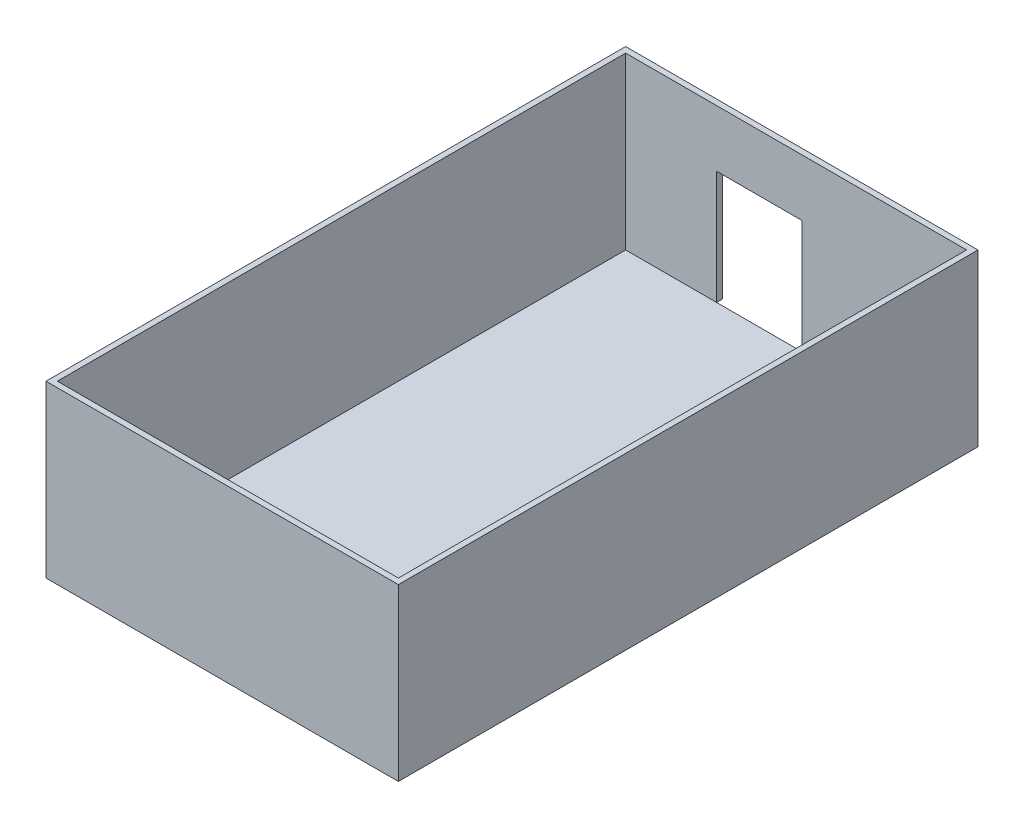
ISO-10303-21;
HEADER;
FILE_DESCRIPTION(('STEP AP214'),'2;1');
FILE_NAME('part.step','',(''),(''),'','','');
FILE_SCHEMA(('AUTOMOTIVE_DESIGN { 1 0 10303 214 1 1 1 1 }'));
ENDSEC;
DATA;
#1=APPLICATION_CONTEXT('core data for automotive mechanical design processes');
#2=APPLICATION_PROTOCOL_DEFINITION('international standard','automotive_design',2000,#1);
#3=PRODUCT_CONTEXT('',#1,'mechanical');
#4=PRODUCT('Part','Part','',(#3));
#5=PRODUCT_RELATED_PRODUCT_CATEGORY('part','',(#4));
#6=PRODUCT_DEFINITION_FORMATION('','',#4);
#7=PRODUCT_DEFINITION_CONTEXT('part definition',#1,'design');
#8=PRODUCT_DEFINITION('design','',#6,#7);
#9=PRODUCT_DEFINITION_SHAPE('','',#8);
#10=(LENGTH_UNIT() NAMED_UNIT(*) SI_UNIT(.MILLI.,.METRE.));
#11=(NAMED_UNIT(*) PLANE_ANGLE_UNIT() SI_UNIT($,.RADIAN.));
#12=(NAMED_UNIT(*) SI_UNIT($,.STERADIAN.) SOLID_ANGLE_UNIT());
#13=UNCERTAINTY_MEASURE_WITH_UNIT(LENGTH_MEASURE(1.E-05),#10,'distance_accuracy_value','');
#14=(GEOMETRIC_REPRESENTATION_CONTEXT(3) GLOBAL_UNCERTAINTY_ASSIGNED_CONTEXT((#13)) GLOBAL_UNIT_ASSIGNED_CONTEXT((#10,
#11,#12)) REPRESENTATION_CONTEXT('',''));
#15=CARTESIAN_POINT('',(0.,0.,0.));
#16=DIRECTION('',(0.,0.,1.));
#17=DIRECTION('',(1.,0.,0.));
#18=AXIS2_PLACEMENT_3D('',#15,#16,#17);
#19=CARTESIAN_POINT('',(0.,3010.,0.));
#20=DIRECTION('',(0.,1.,0.));
#21=DIRECTION('',(0.,0.,1.));
#22=AXIS2_PLACEMENT_3D('',#19,#20,#21);
#23=PLANE('',#22);
#24=DIRECTION('',(1.,0.,0.));
#25=VECTOR('',#24,1.);
#26=CARTESIAN_POINT('',(-6100.,3010.,100.));
#27=LINE('',#26,#25);
#28=CARTESIAN_POINT('',(-6100.,3010.,100.));
#29=VERTEX_POINT('',#28);
#30=CARTESIAN_POINT('',(100.,3010.,100.));
#31=VERTEX_POINT('',#30);
#32=EDGE_CURVE('E230',#29,#31,#27,.T.);
#33=ORIENTED_EDGE('',*,*,#32,.T.);
#34=DIRECTION('',(0.,0.,-1.));
#35=VECTOR('',#34,1.);
#36=CARTESIAN_POINT('',(100.,3010.,100.));
#37=LINE('',#36,#35);
#38=CARTESIAN_POINT('',(100.,3010.,-10100.));
#39=VERTEX_POINT('',#38);
#40=EDGE_CURVE('E234',#31,#39,#37,.T.);
#41=ORIENTED_EDGE('',*,*,#40,.T.);
#42=DIRECTION('',(-1.,0.,0.));
#43=VECTOR('',#42,1.);
#44=CARTESIAN_POINT('',(100.,3010.,-10100.));
#45=LINE('',#44,#43);
#46=CARTESIAN_POINT('',(-6100.,3010.,-10100.));
#47=VERTEX_POINT('',#46);
#48=EDGE_CURVE('E238',#39,#47,#45,.T.);
#49=ORIENTED_EDGE('',*,*,#48,.T.);
#50=DIRECTION('',(0.,0.,1.));
#51=VECTOR('',#50,1.);
#52=CARTESIAN_POINT('',(-6100.,3010.,-10100.));
#53=LINE('',#52,#51);
#54=EDGE_CURVE('E241',#47,#29,#53,.T.);
#55=ORIENTED_EDGE('',*,*,#54,.T.);
#56=EDGE_LOOP('',(#33,#41,#49,#55));
#57=FACE_BOUND('',#56,.T.);
#58=DIRECTION('',(0.,0.,-1.));
#59=VECTOR('',#58,1.);
#60=CARTESIAN_POINT('',(0.,3010.,0.));
#61=LINE('',#60,#59);
#62=CARTESIAN_POINT('',(0.,3010.,0.));
#63=VERTEX_POINT('',#62);
#64=CARTESIAN_POINT('',(0.,3010.,-10000.));
#65=VERTEX_POINT('',#64);
#66=EDGE_CURVE('E192',#63,#65,#61,.T.);
#67=ORIENTED_EDGE('',*,*,#66,.F.);
#68=DIRECTION('',(1.,0.,0.));
#69=VECTOR('',#68,1.);
#70=CARTESIAN_POINT('',(-6000.,3010.,0.));
#71=LINE('',#70,#69);
#72=CARTESIAN_POINT('',(-6000.,3010.,0.));
#73=VERTEX_POINT('',#72);
#74=EDGE_CURVE('E189',#73,#63,#71,.T.);
#75=ORIENTED_EDGE('',*,*,#74,.F.);
#76=DIRECTION('',(0.,0.,1.));
#77=VECTOR('',#76,1.);
#78=CARTESIAN_POINT('',(-6000.,3010.,-10000.));
#79=LINE('',#78,#77);
#80=CARTESIAN_POINT('',(-6000.,3010.,-10000.));
#81=VERTEX_POINT('',#80);
#82=EDGE_CURVE('E199',#81,#73,#79,.T.);
#83=ORIENTED_EDGE('',*,*,#82,.F.);
#84=DIRECTION('',(-1.,0.,0.));
#85=VECTOR('',#84,1.);
#86=CARTESIAN_POINT('',(0.,3010.,-10000.));
#87=LINE('',#86,#85);
#88=EDGE_CURVE('E196',#65,#81,#87,.T.);
#89=ORIENTED_EDGE('',*,*,#88,.F.);
#90=EDGE_LOOP('',(#67,#75,#83,#89));
#91=FACE_BOUND('',#90,.T.);
#92=ADVANCED_FACE('F53',(#57,#91),#23,.T.);
#93=CARTESIAN_POINT('',(0.,10.,0.));
#94=DIRECTION('',(0.,1.,0.));
#95=DIRECTION('',(0.,0.,1.));
#96=AXIS2_PLACEMENT_3D('',#93,#94,#95);
#97=PLANE('',#96);
#98=DIRECTION('',(-1.,0.,0.));
#99=VECTOR('',#98,1.);
#100=CARTESIAN_POINT('',(100.,10.,-10100.));
#101=LINE('',#100,#99);
#102=CARTESIAN_POINT('',(-4400.,10.,-10100.));
#103=VERTEX_POINT('',#102);
#104=CARTESIAN_POINT('',(-6100.,10.,-10100.));
#105=VERTEX_POINT('',#104);
#106=EDGE_CURVE('E251',#103,#105,#101,.T.);
#107=ORIENTED_EDGE('',*,*,#106,.F.);
#108=DIRECTION('',(0.,0.,-1.));
#109=VECTOR('',#108,1.);
#110=CARTESIAN_POINT('',(-4400.,10.,-10000.));
#111=LINE('',#110,#109);
#112=CARTESIAN_POINT('',(-4400.,10.,-10000.));
#113=VERTEX_POINT('',#112);
#114=EDGE_CURVE('E179',#113,#103,#111,.T.);
#115=ORIENTED_EDGE('',*,*,#114,.F.);
#116=DIRECTION('',(-1.,0.,0.));
#117=VECTOR('',#116,1.);
#118=CARTESIAN_POINT('',(0.,10.,-10000.));
#119=LINE('',#118,#117);
#120=CARTESIAN_POINT('',(-6000.,10.,-10000.));
#121=VERTEX_POINT('',#120);
#122=EDGE_CURVE('E165',#113,#121,#119,.T.);
#123=ORIENTED_EDGE('',*,*,#122,.T.);
#124=DIRECTION('',(0.,0.,1.));
#125=VECTOR('',#124,1.);
#126=CARTESIAN_POINT('',(-6000.,10.,-10000.));
#127=LINE('',#126,#125);
#128=CARTESIAN_POINT('',(-6000.,10.,0.));
#129=VERTEX_POINT('',#128);
#130=EDGE_CURVE('E193',#121,#129,#127,.T.);
#131=ORIENTED_EDGE('',*,*,#130,.T.);
#132=DIRECTION('',(1.,0.,0.));
#133=VECTOR('',#132,1.);
#134=CARTESIAN_POINT('',(-6000.,10.,0.));
#135=LINE('',#134,#133);
#136=CARTESIAN_POINT('',(0.,10.,0.));
#137=VERTEX_POINT('',#136);
#138=EDGE_CURVE('E182',#129,#137,#135,.T.);
#139=ORIENTED_EDGE('',*,*,#138,.T.);
#140=DIRECTION('',(0.,0.,-1.));
#141=VECTOR('',#140,1.);
#142=CARTESIAN_POINT('',(0.,10.,0.));
#143=LINE('',#142,#141);
#144=CARTESIAN_POINT('',(0.,10.,-10000.));
#145=VERTEX_POINT('',#144);
#146=EDGE_CURVE('E206',#137,#145,#143,.T.);
#147=ORIENTED_EDGE('',*,*,#146,.T.);
#148=CARTESIAN_POINT('',(-2900.,10.0000000000001,-10000.));
#149=VERTEX_POINT('',#148);
#150=EDGE_CURVE('E210',#145,#149,#119,.T.);
#151=ORIENTED_EDGE('',*,*,#150,.T.);
#152=DIRECTION('',(0.,0.,-1.));
#153=VECTOR('',#152,1.);
#154=CARTESIAN_POINT('',(-2900.,10.0000000000001,-10000.));
#155=LINE('',#154,#153);
#156=CARTESIAN_POINT('',(-2900.,10.0000000000001,-10100.));
#157=VERTEX_POINT('',#156);
#158=EDGE_CURVE('E183',#149,#157,#155,.T.);
#159=ORIENTED_EDGE('',*,*,#158,.T.);
#160=CARTESIAN_POINT('',(100.,10.,-10100.));
#161=VERTEX_POINT('',#160);
#162=EDGE_CURVE('E252',#161,#157,#101,.T.);
#163=ORIENTED_EDGE('',*,*,#162,.F.);
#164=DIRECTION('',(0.,0.,-1.));
#165=VECTOR('',#164,1.);
#166=CARTESIAN_POINT('',(100.,10.,100.));
#167=LINE('',#166,#165);
#168=CARTESIAN_POINT('',(100.,10.,100.));
#169=VERTEX_POINT('',#168);
#170=EDGE_CURVE('E248',#169,#161,#167,.T.);
#171=ORIENTED_EDGE('',*,*,#170,.F.);
#172=DIRECTION('',(1.,0.,0.));
#173=VECTOR('',#172,1.);
#174=CARTESIAN_POINT('',(-6100.,10.,100.));
#175=LINE('',#174,#173);
#176=CARTESIAN_POINT('',(-6100.,10.,100.));
#177=VERTEX_POINT('',#176);
#178=EDGE_CURVE('E229',#177,#169,#175,.T.);
#179=ORIENTED_EDGE('',*,*,#178,.F.);
#180=DIRECTION('',(0.,0.,1.));
#181=VECTOR('',#180,1.);
#182=CARTESIAN_POINT('',(-6100.,10.,-10100.));
#183=LINE('',#182,#181);
#184=EDGE_CURVE('E235',#105,#177,#183,.T.);
#185=ORIENTED_EDGE('',*,*,#184,.F.);
#186=EDGE_LOOP('',(#107,#115,#123,#131,#139,#147,#151,#159,#163,#171,#179,#185));
#187=FACE_BOUND('',#186,.T.);
#188=ADVANCED_FACE('F276',(#187),#97,.F.);
#189=CARTESIAN_POINT('',(-6100.,3010.,100.));
#190=DIRECTION('',(0.,0.,-1.));
#191=DIRECTION('',(-1.,0.,0.));
#192=AXIS2_PLACEMENT_3D('',#189,#190,#191);
#193=PLANE('',#192);
#194=ORIENTED_EDGE('',*,*,#178,.T.);
#195=DIRECTION('',(0.,-1.,0.));
#196=VECTOR('',#195,1.);
#197=CARTESIAN_POINT('',(100.,3010.,100.));
#198=LINE('',#197,#196);
#199=EDGE_CURVE('E12',#31,#169,#198,.T.);
#200=ORIENTED_EDGE('',*,*,#199,.F.);
#201=ORIENTED_EDGE('',*,*,#32,.F.);
#202=DIRECTION('',(0.,-1.,0.));
#203=VECTOR('',#202,1.);
#204=CARTESIAN_POINT('',(-6100.,3010.,100.));
#205=LINE('',#204,#203);
#206=EDGE_CURVE('E244',#29,#177,#205,.T.);
#207=ORIENTED_EDGE('',*,*,#206,.T.);
#208=EDGE_LOOP('',(#194,#200,#201,#207));
#209=FACE_BOUND('',#208,.T.);
#210=ADVANCED_FACE('F55',(#209),#193,.F.);
#211=CARTESIAN_POINT('',(100.,3010.,100.));
#212=DIRECTION('',(-1.,0.,0.));
#213=DIRECTION('',(0.,0.,1.));
#214=AXIS2_PLACEMENT_3D('',#211,#212,#213);
#215=PLANE('',#214);
#216=ORIENTED_EDGE('',*,*,#170,.T.);
#217=DIRECTION('',(0.,-1.,0.));
#218=VECTOR('',#217,1.);
#219=CARTESIAN_POINT('',(100.,3010.,-10100.));
#220=LINE('',#219,#218);
#221=EDGE_CURVE('E62',#39,#161,#220,.T.);
#222=ORIENTED_EDGE('',*,*,#221,.F.);
#223=ORIENTED_EDGE('',*,*,#40,.F.);
#224=ORIENTED_EDGE('',*,*,#199,.T.);
#225=EDGE_LOOP('',(#216,#222,#223,#224));
#226=FACE_BOUND('',#225,.T.);
#227=ADVANCED_FACE('F304',(#226),#215,.F.);
#228=CARTESIAN_POINT('',(100.,3010.,-10100.));
#229=DIRECTION('',(0.,0.,1.));
#230=DIRECTION('',(1.,0.,0.));
#231=AXIS2_PLACEMENT_3D('',#228,#229,#230);
#232=PLANE('',#231);
#233=DIRECTION('',(1.,0.,0.));
#234=VECTOR('',#233,1.);
#235=CARTESIAN_POINT('',(-4400.,2010.,-10100.));
#236=LINE('',#235,#234);
#237=CARTESIAN_POINT('',(-4400.,2010.,-10100.));
#238=VERTEX_POINT('',#237);
#239=CARTESIAN_POINT('',(-2900.,2010.,-10100.));
#240=VERTEX_POINT('',#239);
#241=EDGE_CURVE('E170',#238,#240,#236,.T.);
#242=ORIENTED_EDGE('',*,*,#241,.F.);
#243=DIRECTION('',(0.,1.,0.));
#244=VECTOR('',#243,1.);
#245=CARTESIAN_POINT('',(-4400.,10.,-10100.));
#246=LINE('',#245,#244);
#247=EDGE_CURVE('E150',#103,#238,#246,.T.);
#248=ORIENTED_EDGE('',*,*,#247,.F.);
#249=ORIENTED_EDGE('',*,*,#106,.T.);
#250=DIRECTION('',(0.,-1.,0.));
#251=VECTOR('',#250,1.);
#252=CARTESIAN_POINT('',(-6100.,3010.,-10100.));
#253=LINE('',#252,#251);
#254=EDGE_CURVE('E261',#47,#105,#253,.T.);
#255=ORIENTED_EDGE('',*,*,#254,.F.);
#256=ORIENTED_EDGE('',*,*,#48,.F.);
#257=ORIENTED_EDGE('',*,*,#221,.T.);
#258=ORIENTED_EDGE('',*,*,#162,.T.);
#259=DIRECTION('',(0.,-1.,0.));
#260=VECTOR('',#259,1.);
#261=CARTESIAN_POINT('',(-2900.,10.0000000000001,-10100.));
#262=LINE('',#261,#260);
#263=EDGE_CURVE('E167',#240,#157,#262,.T.);
#264=ORIENTED_EDGE('',*,*,#263,.F.);
#265=EDGE_LOOP('',(#242,#248,#249,#255,#256,#257,#258,#264));
#266=FACE_BOUND('',#265,.T.);
#267=ADVANCED_FACE('F270',(#266),#232,.F.);
#268=CARTESIAN_POINT('',(-6100.,3010.,-10100.));
#269=DIRECTION('',(1.,0.,0.));
#270=DIRECTION('',(0.,0.,-1.));
#271=AXIS2_PLACEMENT_3D('',#268,#269,#270);
#272=PLANE('',#271);
#273=ORIENTED_EDGE('',*,*,#184,.T.);
#274=ORIENTED_EDGE('',*,*,#206,.F.);
#275=ORIENTED_EDGE('',*,*,#54,.F.);
#276=ORIENTED_EDGE('',*,*,#254,.T.);
#277=EDGE_LOOP('',(#273,#274,#275,#276));
#278=FACE_BOUND('',#277,.T.);
#279=ADVANCED_FACE('F298',(#278),#272,.F.);
#280=CARTESIAN_POINT('',(-6000.,3010.,0.));
#281=DIRECTION('',(0.,0.,-1.));
#282=DIRECTION('',(-1.,0.,0.));
#283=AXIS2_PLACEMENT_3D('',#280,#281,#282);
#284=PLANE('',#283);
#285=ORIENTED_EDGE('',*,*,#138,.F.);
#286=DIRECTION('',(0.,-1.,0.));
#287=VECTOR('',#286,1.);
#288=CARTESIAN_POINT('',(-6000.,3010.,0.));
#289=LINE('',#288,#287);
#290=EDGE_CURVE('E202',#73,#129,#289,.T.);
#291=ORIENTED_EDGE('',*,*,#290,.F.);
#292=ORIENTED_EDGE('',*,*,#74,.T.);
#293=DIRECTION('',(0.,-1.,0.));
#294=VECTOR('',#293,1.);
#295=CARTESIAN_POINT('',(0.,3010.,0.));
#296=LINE('',#295,#294);
#297=EDGE_CURVE('E225',#63,#137,#296,.T.);
#298=ORIENTED_EDGE('',*,*,#297,.T.);
#299=EDGE_LOOP('',(#285,#291,#292,#298));
#300=FACE_BOUND('',#299,.T.);
#301=ADVANCED_FACE('F287',(#300),#284,.T.);
#302=CARTESIAN_POINT('',(0.,3010.,0.));
#303=DIRECTION('',(-1.,0.,0.));
#304=DIRECTION('',(0.,0.,1.));
#305=AXIS2_PLACEMENT_3D('',#302,#303,#304);
#306=PLANE('',#305);
#307=ORIENTED_EDGE('',*,*,#146,.F.);
#308=ORIENTED_EDGE('',*,*,#297,.F.);
#309=ORIENTED_EDGE('',*,*,#66,.T.);
#310=DIRECTION('',(0.,-1.,0.));
#311=VECTOR('',#310,1.);
#312=CARTESIAN_POINT('',(0.,3010.,-10000.));
#313=LINE('',#312,#311);
#314=EDGE_CURVE('E222',#65,#145,#313,.T.);
#315=ORIENTED_EDGE('',*,*,#314,.T.);
#316=EDGE_LOOP('',(#307,#308,#309,#315));
#317=FACE_BOUND('',#316,.T.);
#318=ADVANCED_FACE('F284',(#317),#306,.T.);
#319=CARTESIAN_POINT('',(0.,3010.,-10000.));
#320=DIRECTION('',(0.,0.,1.));
#321=DIRECTION('',(1.,0.,0.));
#322=AXIS2_PLACEMENT_3D('',#319,#320,#321);
#323=PLANE('',#322);
#324=DIRECTION('',(0.,1.,0.));
#325=VECTOR('',#324,1.);
#326=CARTESIAN_POINT('',(-4400.,10.,-10000.));
#327=LINE('',#326,#325);
#328=CARTESIAN_POINT('',(-4400.,2010.,-10000.));
#329=VERTEX_POINT('',#328);
#330=EDGE_CURVE('E147',#113,#329,#327,.T.);
#331=ORIENTED_EDGE('',*,*,#330,.T.);
#332=DIRECTION('',(1.,0.,0.));
#333=VECTOR('',#332,1.);
#334=CARTESIAN_POINT('',(-4400.,2010.,-10000.));
#335=LINE('',#334,#333);
#336=CARTESIAN_POINT('',(-2900.,2010.,-10000.));
#337=VERTEX_POINT('',#336);
#338=EDGE_CURVE('E158',#329,#337,#335,.T.);
#339=ORIENTED_EDGE('',*,*,#338,.T.);
#340=DIRECTION('',(0.,-1.,0.));
#341=VECTOR('',#340,1.);
#342=CARTESIAN_POINT('',(-2900.,10.0000000000001,-10000.));
#343=LINE('',#342,#341);
#344=EDGE_CURVE('E69',#337,#149,#343,.T.);
#345=ORIENTED_EDGE('',*,*,#344,.T.);
#346=ORIENTED_EDGE('',*,*,#150,.F.);
#347=ORIENTED_EDGE('',*,*,#314,.F.);
#348=ORIENTED_EDGE('',*,*,#88,.T.);
#349=DIRECTION('',(0.,-1.,0.));
#350=VECTOR('',#349,1.);
#351=CARTESIAN_POINT('',(-6000.,3010.,-10000.));
#352=LINE('',#351,#350);
#353=EDGE_CURVE('E77',#81,#121,#352,.T.);
#354=ORIENTED_EDGE('',*,*,#353,.T.);
#355=ORIENTED_EDGE('',*,*,#122,.F.);
#356=EDGE_LOOP('',(#331,#339,#345,#346,#347,#348,#354,#355));
#357=FACE_BOUND('',#356,.T.);
#358=ADVANCED_FACE('F164',(#357),#323,.T.);
#359=CARTESIAN_POINT('',(-6000.,3010.,-10000.));
#360=DIRECTION('',(1.,0.,0.));
#361=DIRECTION('',(0.,0.,-1.));
#362=AXIS2_PLACEMENT_3D('',#359,#360,#361);
#363=PLANE('',#362);
#364=ORIENTED_EDGE('',*,*,#130,.F.);
#365=ORIENTED_EDGE('',*,*,#353,.F.);
#366=ORIENTED_EDGE('',*,*,#82,.T.);
#367=ORIENTED_EDGE('',*,*,#290,.T.);
#368=EDGE_LOOP('',(#364,#365,#366,#367));
#369=FACE_BOUND('',#368,.T.);
#370=ADVANCED_FACE('F292',(#369),#363,.T.);
#371=CARTESIAN_POINT('',(-4400.,10.,-10000.));
#372=DIRECTION('',(-1.,0.,0.));
#373=DIRECTION('',(0.,0.,1.));
#374=AXIS2_PLACEMENT_3D('',#371,#372,#373);
#375=PLANE('',#374);
#376=ORIENTED_EDGE('',*,*,#247,.T.);
#377=DIRECTION('',(0.,0.,-1.));
#378=VECTOR('',#377,1.);
#379=CARTESIAN_POINT('',(-4400.,2010.,-10000.));
#380=LINE('',#379,#378);
#381=EDGE_CURVE('E143',#329,#238,#380,.T.);
#382=ORIENTED_EDGE('',*,*,#381,.F.);
#383=ORIENTED_EDGE('',*,*,#330,.F.);
#384=ORIENTED_EDGE('',*,*,#114,.T.);
#385=EDGE_LOOP('',(#376,#382,#383,#384));
#386=FACE_BOUND('',#385,.T.);
#387=ADVANCED_FACE('F145',(#386),#375,.F.);
#388=CARTESIAN_POINT('',(-2900.,10.0000000000001,-10000.));
#389=DIRECTION('',(1.,0.,0.));
#390=DIRECTION('',(0.,0.,-1.));
#391=AXIS2_PLACEMENT_3D('',#388,#389,#390);
#392=PLANE('',#391);
#393=ORIENTED_EDGE('',*,*,#263,.T.);
#394=ORIENTED_EDGE('',*,*,#158,.F.);
#395=ORIENTED_EDGE('',*,*,#344,.F.);
#396=DIRECTION('',(0.,0.,-1.));
#397=VECTOR('',#396,1.);
#398=CARTESIAN_POINT('',(-2900.,2010.,-10000.));
#399=LINE('',#398,#397);
#400=EDGE_CURVE('E155',#337,#240,#399,.T.);
#401=ORIENTED_EDGE('',*,*,#400,.T.);
#402=EDGE_LOOP('',(#393,#394,#395,#401));
#403=FACE_BOUND('',#402,.T.);
#404=ADVANCED_FACE('F279',(#403),#392,.F.);
#405=CARTESIAN_POINT('',(-4400.,2010.,-10000.));
#406=DIRECTION('',(0.,1.,0.));
#407=DIRECTION('',(0.,0.,1.));
#408=AXIS2_PLACEMENT_3D('',#405,#406,#407);
#409=PLANE('',#408);
#410=ORIENTED_EDGE('',*,*,#241,.T.);
#411=ORIENTED_EDGE('',*,*,#400,.F.);
#412=ORIENTED_EDGE('',*,*,#338,.F.);
#413=ORIENTED_EDGE('',*,*,#381,.T.);
#414=EDGE_LOOP('',(#410,#411,#412,#413));
#415=FACE_BOUND('',#414,.T.);
#416=ADVANCED_FACE('F159',(#415),#409,.F.);
#417=CLOSED_SHELL('',(#92,#188,#210,#227,#267,#279,#301,#318,#358,#370,#387,#404,#416));
#418=MANIFOLD_SOLID_BREP('B2',#417);
#419=CARTESIAN_POINT('',(0.,10.,0.));
#420=DIRECTION('',(-1.,0.,0.));
#421=DIRECTION('',(0.,0.,1.));
#422=AXIS2_PLACEMENT_3D('',#419,#420,#421);
#423=PLANE('',#422);
#424=DIRECTION('',(0.,0.,-1.));
#425=VECTOR('',#424,1.);
#426=CARTESIAN_POINT('',(0.,0.,0.));
#427=LINE('',#426,#425);
#428=CARTESIAN_POINT('',(0.,0.,0.));
#429=VERTEX_POINT('',#428);
#430=CARTESIAN_POINT('',(0.,0.,-10000.));
#431=VERTEX_POINT('',#430);
#432=EDGE_CURVE('E499',#429,#431,#427,.T.);
#433=ORIENTED_EDGE('',*,*,#432,.T.);
#434=DIRECTION('',(0.,-1.,0.));
#435=VECTOR('',#434,1.);
#436=CARTESIAN_POINT('',(0.,10.,-10000.));
#437=LINE('',#436,#435);
#438=CARTESIAN_POINT('',(0.,10.,-10000.));
#439=VERTEX_POINT('',#438);
#440=EDGE_CURVE('E51',#439,#431,#437,.T.);
#441=ORIENTED_EDGE('',*,*,#440,.F.);
#442=DIRECTION('',(0.,0.,-1.));
#443=VECTOR('',#442,1.);
#444=CARTESIAN_POINT('',(0.,10.,0.));
#445=LINE('',#444,#443);
#446=CARTESIAN_POINT('',(0.,10.,0.));
#447=VERTEX_POINT('',#446);
#448=EDGE_CURVE('E487',#447,#439,#445,.T.);
#449=ORIENTED_EDGE('',*,*,#448,.F.);
#450=DIRECTION('',(0.,-1.,0.));
#451=VECTOR('',#450,1.);
#452=CARTESIAN_POINT('',(0.,10.,0.));
#453=LINE('',#452,#451);
#454=EDGE_CURVE('E495',#447,#429,#453,.T.);
#455=ORIENTED_EDGE('',*,*,#454,.T.);
#456=EDGE_LOOP('',(#433,#441,#449,#455));
#457=FACE_BOUND('',#456,.T.);
#458=ADVANCED_FACE('F436',(#457),#423,.F.);
#459=CARTESIAN_POINT('',(0.,10.,-10000.));
#460=DIRECTION('',(0.,0.,1.));
#461=DIRECTION('',(1.,0.,0.));
#462=AXIS2_PLACEMENT_3D('',#459,#460,#461);
#463=PLANE('',#462);
#464=DIRECTION('',(-1.,0.,0.));
#465=VECTOR('',#464,1.);
#466=CARTESIAN_POINT('',(0.,0.,-10000.));
#467=LINE('',#466,#465);
#468=CARTESIAN_POINT('',(-6000.,0.,-10000.));
#469=VERTEX_POINT('',#468);
#470=EDGE_CURVE('E491',#431,#469,#467,.T.);
#471=ORIENTED_EDGE('',*,*,#470,.T.);
#472=DIRECTION('',(0.,-1.,0.));
#473=VECTOR('',#472,1.);
#474=CARTESIAN_POINT('',(-6000.,10.,-10000.));
#475=LINE('',#474,#473);
#476=CARTESIAN_POINT('',(-6000.,10.,-10000.));
#477=VERTEX_POINT('',#476);
#478=EDGE_CURVE('E444',#477,#469,#475,.T.);
#479=ORIENTED_EDGE('',*,*,#478,.F.);
#480=DIRECTION('',(-1.,0.,0.));
#481=VECTOR('',#480,1.);
#482=CARTESIAN_POINT('',(0.,10.,-10000.));
#483=LINE('',#482,#481);
#484=EDGE_CURVE('E482',#439,#477,#483,.T.);
#485=ORIENTED_EDGE('',*,*,#484,.F.);
#486=ORIENTED_EDGE('',*,*,#440,.T.);
#487=EDGE_LOOP('',(#471,#479,#485,#486));
#488=FACE_BOUND('',#487,.T.);
#489=ADVANCED_FACE('F490',(#488),#463,.F.);
#490=CARTESIAN_POINT('',(-6000.,10.,0.));
#491=DIRECTION('',(1.,0.,0.));
#492=DIRECTION('',(0.,0.,-1.));
#493=AXIS2_PLACEMENT_3D('',#490,#491,#492);
#494=PLANE('',#493);
#495=DIRECTION('',(0.,0.,1.));
#496=VECTOR('',#495,1.);
#497=CARTESIAN_POINT('',(-6000.,0.,0.));
#498=LINE('',#497,#496);
#499=CARTESIAN_POINT('',(-6000.,0.,0.));
#500=VERTEX_POINT('',#499);
#501=EDGE_CURVE('E469',#469,#500,#498,.T.);
#502=ORIENTED_EDGE('',*,*,#501,.T.);
#503=DIRECTION('',(0.,-1.,0.));
#504=VECTOR('',#503,1.);
#505=CARTESIAN_POINT('',(-6000.,10.,0.));
#506=LINE('',#505,#504);
#507=CARTESIAN_POINT('',(-6000.,10.,0.));
#508=VERTEX_POINT('',#507);
#509=EDGE_CURVE('E492',#508,#500,#506,.T.);
#510=ORIENTED_EDGE('',*,*,#509,.F.);
#511=DIRECTION('',(0.,0.,1.));
#512=VECTOR('',#511,1.);
#513=CARTESIAN_POINT('',(-6000.,10.,0.));
#514=LINE('',#513,#512);
#515=EDGE_CURVE('E485',#477,#508,#514,.T.);
#516=ORIENTED_EDGE('',*,*,#515,.F.);
#517=ORIENTED_EDGE('',*,*,#478,.T.);
#518=EDGE_LOOP('',(#502,#510,#516,#517));
#519=FACE_BOUND('',#518,.T.);
#520=ADVANCED_FACE('F493',(#519),#494,.F.);
#521=CARTESIAN_POINT('',(0.,10.,0.));
#522=DIRECTION('',(0.,0.,-1.));
#523=DIRECTION('',(-1.,0.,0.));
#524=AXIS2_PLACEMENT_3D('',#521,#522,#523);
#525=PLANE('',#524);
#526=DIRECTION('',(1.,0.,0.));
#527=VECTOR('',#526,1.);
#528=CARTESIAN_POINT('',(0.,0.,0.));
#529=LINE('',#528,#527);
#530=EDGE_CURVE('E475',#500,#429,#529,.T.);
#531=ORIENTED_EDGE('',*,*,#530,.T.);
#532=ORIENTED_EDGE('',*,*,#454,.F.);
#533=DIRECTION('',(1.,0.,0.));
#534=VECTOR('',#533,1.);
#535=CARTESIAN_POINT('',(0.,10.,0.));
#536=LINE('',#535,#534);
#537=EDGE_CURVE('E452',#508,#447,#536,.T.);
#538=ORIENTED_EDGE('',*,*,#537,.F.);
#539=ORIENTED_EDGE('',*,*,#509,.T.);
#540=EDGE_LOOP('',(#531,#532,#538,#539));
#541=FACE_BOUND('',#540,.T.);
#542=ADVANCED_FACE('F506',(#541),#525,.F.);
#543=CARTESIAN_POINT('',(0.,10.,0.));
#544=DIRECTION('',(0.,1.,0.));
#545=DIRECTION('',(0.,0.,1.));
#546=AXIS2_PLACEMENT_3D('',#543,#544,#545);
#547=PLANE('',#546);
#548=ORIENTED_EDGE('',*,*,#448,.T.);
#549=ORIENTED_EDGE('',*,*,#484,.T.);
#550=ORIENTED_EDGE('',*,*,#515,.T.);
#551=ORIENTED_EDGE('',*,*,#537,.T.);
#552=EDGE_LOOP('',(#548,#549,#550,#551));
#553=FACE_BOUND('',#552,.T.);
#554=ADVANCED_FACE('F483',(#553),#547,.T.);
#555=CARTESIAN_POINT('',(0.,0.,0.));
#556=DIRECTION('',(0.,1.,0.));
#557=DIRECTION('',(0.,0.,1.));
#558=AXIS2_PLACEMENT_3D('',#555,#556,#557);
#559=PLANE('',#558);
#560=ORIENTED_EDGE('',*,*,#432,.F.);
#561=ORIENTED_EDGE('',*,*,#530,.F.);
#562=ORIENTED_EDGE('',*,*,#501,.F.);
#563=ORIENTED_EDGE('',*,*,#470,.F.);
#564=EDGE_LOOP('',(#560,#561,#562,#563));
#565=FACE_BOUND('',#564,.T.);
#566=ADVANCED_FACE('F509',(#565),#559,.F.);
#567=CLOSED_SHELL('',(#458,#489,#520,#542,#554,#566));
#568=MANIFOLD_SOLID_BREP('B6',#567);
#569=ADVANCED_BREP_SHAPE_REPRESENTATION('',(#18,#418,#568),#14);
#570=SHAPE_DEFINITION_REPRESENTATION(#9,#569);
ENDSEC;
END-ISO-10303-21;
